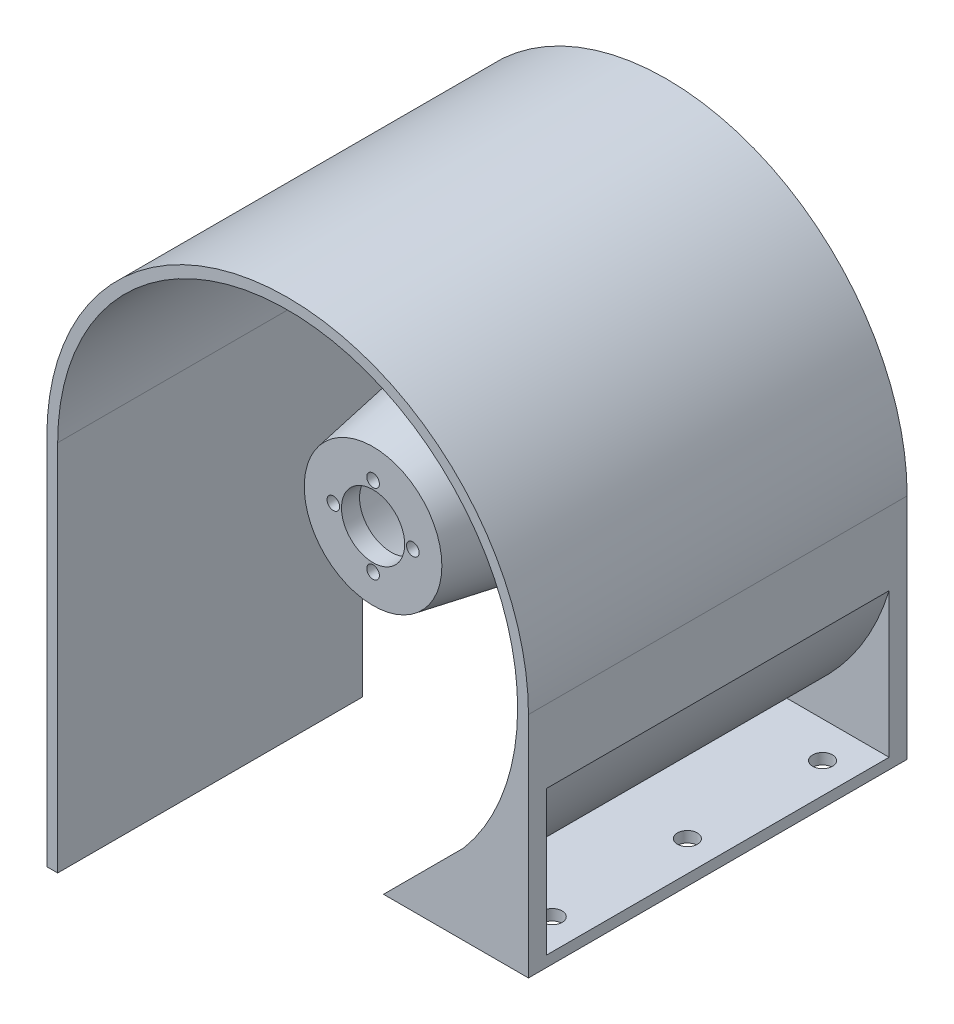
ISO-10303-21;
HEADER;
FILE_DESCRIPTION(('STEP AP214'),'2;1');
FILE_NAME('part.step','',(''),(''),'','','');
FILE_SCHEMA(('AUTOMOTIVE_DESIGN { 1 0 10303 214 1 1 1 1 }'));
ENDSEC;
DATA;
#1=APPLICATION_CONTEXT('core data for automotive mechanical design processes');
#2=APPLICATION_PROTOCOL_DEFINITION('international standard','automotive_design',2000,#1);
#3=PRODUCT_CONTEXT('',#1,'mechanical');
#4=PRODUCT('Part','Part','',(#3));
#5=PRODUCT_RELATED_PRODUCT_CATEGORY('part','',(#4));
#6=PRODUCT_DEFINITION_FORMATION('','',#4);
#7=PRODUCT_DEFINITION_CONTEXT('part definition',#1,'design');
#8=PRODUCT_DEFINITION('design','',#6,#7);
#9=PRODUCT_DEFINITION_SHAPE('','',#8);
#10=(LENGTH_UNIT() NAMED_UNIT(*) SI_UNIT(.MILLI.,.METRE.));
#11=(NAMED_UNIT(*) PLANE_ANGLE_UNIT() SI_UNIT($,.RADIAN.));
#12=(NAMED_UNIT(*) SI_UNIT($,.STERADIAN.) SOLID_ANGLE_UNIT());
#13=UNCERTAINTY_MEASURE_WITH_UNIT(LENGTH_MEASURE(1.E-05),#10,'distance_accuracy_value','');
#14=(GEOMETRIC_REPRESENTATION_CONTEXT(3) GLOBAL_UNCERTAINTY_ASSIGNED_CONTEXT((#13)) GLOBAL_UNIT_ASSIGNED_CONTEXT((#10,
#11,#12)) REPRESENTATION_CONTEXT('',''));
#15=CARTESIAN_POINT('',(0.,0.,0.));
#16=DIRECTION('',(0.,0.,1.));
#17=DIRECTION('',(1.,0.,0.));
#18=AXIS2_PLACEMENT_3D('',#15,#16,#17);
#19=CARTESIAN_POINT('',(31.75,0.,104.85));
#20=DIRECTION('',(0.,0.,1.));
#21=DIRECTION('',(1.,0.,0.));
#22=AXIS2_PLACEMENT_3D('',#19,#20,#21);
#23=PLANE('',#22);
#24=CARTESIAN_POINT('',(31.75,0.,104.85));
#25=DIRECTION('',(0.,0.,1.));
#26=DIRECTION('',(1.,0.,0.));
#27=AXIS2_PLACEMENT_3D('',#24,#25,#26);
#28=CIRCLE('',#27,63.675);
#29=CARTESIAN_POINT('',(80.527879915601,-40.9295010467903,104.85));
#30=VERTEX_POINT('',#29);
#31=CARTESIAN_POINT('',(-31.925,0.,104.85));
#32=VERTEX_POINT('',#31);
#33=EDGE_CURVE('E168',#30,#32,#28,.T.);
#34=ORIENTED_EDGE('',*,*,#33,.F.);
#35=DIRECTION('',(-0.707106781186546,-0.707106781186549,0.));
#36=VECTOR('',#35,1.);
#37=CARTESIAN_POINT('',(60.7286904811958,-60.7286904811956,104.85));
#38=LINE('',#37,#36);
#39=CARTESIAN_POINT('',(58.2823809623914,-63.175,104.85));
#40=VERTEX_POINT('',#39);
#41=EDGE_CURVE('E165',#30,#40,#38,.T.);
#42=ORIENTED_EDGE('',*,*,#41,.T.);
#43=DIRECTION('',(-1.,0.,0.));
#44=VECTOR('',#43,1.);
#45=CARTESIAN_POINT('',(98.425,-63.175,104.85));
#46=LINE('',#45,#44);
#47=CARTESIAN_POINT('',(98.425,-63.175,104.85));
#48=VERTEX_POINT('',#47);
#49=EDGE_CURVE('E242',#48,#40,#46,.T.);
#50=ORIENTED_EDGE('',*,*,#49,.F.);
#51=DIRECTION('',(0.,-1.,0.));
#52=VECTOR('',#51,1.);
#53=CARTESIAN_POINT('',(98.425,-66.675,104.85));
#54=LINE('',#53,#52);
#55=CARTESIAN_POINT('',(98.425,-4.71844785465692E-13,104.85));
#56=VERTEX_POINT('',#55);
#57=EDGE_CURVE('E249',#56,#48,#54,.T.);
#58=ORIENTED_EDGE('',*,*,#57,.F.);
#59=CARTESIAN_POINT('',(31.75,0.,104.85));
#60=DIRECTION('',(0.,0.,1.));
#61=DIRECTION('',(1.,0.,0.));
#62=AXIS2_PLACEMENT_3D('',#59,#60,#61);
#63=CIRCLE('',#62,66.675);
#64=CARTESIAN_POINT('',(-34.925,0.,104.85));
#65=VERTEX_POINT('',#64);
#66=EDGE_CURVE('E258',#56,#65,#63,.T.);
#67=ORIENTED_EDGE('',*,*,#66,.T.);
#68=DIRECTION('',(0.,-1.,0.));
#69=VECTOR('',#68,1.);
#70=CARTESIAN_POINT('',(-34.925,0.,104.85));
#71=LINE('',#70,#69);
#72=CARTESIAN_POINT('',(-34.925,-103.175,104.85));
#73=VERTEX_POINT('',#72);
#74=EDGE_CURVE('E260',#65,#73,#71,.T.);
#75=ORIENTED_EDGE('',*,*,#74,.T.);
#76=DIRECTION('',(-1.,0.,0.));
#77=VECTOR('',#76,1.);
#78=CARTESIAN_POINT('',(-34.925,-103.175,104.85));
#79=LINE('',#78,#77);
#80=CARTESIAN_POINT('',(-31.925,-103.175,104.85));
#81=VERTEX_POINT('',#80);
#82=EDGE_CURVE('E158',#81,#73,#79,.T.);
#83=ORIENTED_EDGE('',*,*,#82,.F.);
#84=DIRECTION('',(0.,-1.,0.));
#85=VECTOR('',#84,1.);
#86=CARTESIAN_POINT('',(-31.925,0.,104.85));
#87=LINE('',#86,#85);
#88=EDGE_CURVE('E185',#32,#81,#87,.T.);
#89=ORIENTED_EDGE('',*,*,#88,.F.);
#90=EDGE_LOOP('',(#34,#42,#50,#58,#67,#75,#83,#89));
#91=FACE_BOUND('',#90,.T.);
#92=ADVANCED_FACE('F46',(#91),#23,.T.);
#93=CARTESIAN_POINT('',(0.,-63.175,0.));
#94=DIRECTION('',(0.,-1.,0.));
#95=DIRECTION('',(0.,0.,-1.));
#96=AXIS2_PLACEMENT_3D('',#93,#94,#95);
#97=PLANE('',#96);
#98=DIRECTION('',(1.,0.,0.));
#99=VECTOR('',#98,1.);
#100=CARTESIAN_POINT('',(-34.925,-63.175,20.5));
#101=LINE('',#100,#99);
#102=CARTESIAN_POINT('',(-34.925,-63.175,20.5));
#103=VERTEX_POINT('',#102);
#104=CARTESIAN_POINT('',(-31.925,-63.175,20.5));
#105=VERTEX_POINT('',#104);
#106=EDGE_CURVE('E62',#103,#105,#101,.T.);
#107=ORIENTED_EDGE('',*,*,#106,.F.);
#108=DIRECTION('',(0.,0.,-1.));
#109=VECTOR('',#108,1.);
#110=CARTESIAN_POINT('',(-34.925,-63.175,104.85));
#111=LINE('',#110,#109);
#112=CARTESIAN_POINT('',(-34.925,-63.175,0.));
#113=VERTEX_POINT('',#112);
#114=EDGE_CURVE('E164',#103,#113,#111,.T.);
#115=ORIENTED_EDGE('',*,*,#114,.T.);
#116=DIRECTION('',(1.,0.,0.));
#117=VECTOR('',#116,1.);
#118=CARTESIAN_POINT('',(-34.925,-63.175,0.));
#119=LINE('',#118,#117);
#120=CARTESIAN_POINT('',(98.425,-63.175,0.));
#121=VERTEX_POINT('',#120);
#122=EDGE_CURVE('E231',#113,#121,#119,.T.);
#123=ORIENTED_EDGE('',*,*,#122,.T.);
#124=DIRECTION('',(0.,0.,1.));
#125=VECTOR('',#124,1.);
#126=CARTESIAN_POINT('',(98.425,-63.175,0.));
#127=LINE('',#126,#125);
#128=EDGE_CURVE('E240',#121,#48,#127,.T.);
#129=ORIENTED_EDGE('',*,*,#128,.T.);
#130=ORIENTED_EDGE('',*,*,#49,.T.);
#131=DIRECTION('',(0.,0.,1.));
#132=VECTOR('',#131,1.);
#133=CARTESIAN_POINT('',(58.2823809623914,-63.175,-179.746891489116));
#134=LINE('',#133,#132);
#135=CARTESIAN_POINT('',(58.2823809623914,-63.175,5.));
#136=VERTEX_POINT('',#135);
#137=EDGE_CURVE('E176',#136,#40,#134,.T.);
#138=ORIENTED_EDGE('',*,*,#137,.F.);
#139=DIRECTION('',(-1.,0.,0.));
#140=VECTOR('',#139,1.);
#141=CARTESIAN_POINT('',(0.,-63.175,5.));
#142=LINE('',#141,#140);
#143=CARTESIAN_POINT('',(-31.925,-63.175,5.));
#144=VERTEX_POINT('',#143);
#145=EDGE_CURVE('E175',#136,#144,#142,.T.);
#146=ORIENTED_EDGE('',*,*,#145,.T.);
#147=DIRECTION('',(0.,0.,1.));
#148=VECTOR('',#147,1.);
#149=CARTESIAN_POINT('',(-31.925,-63.175,-179.746891489116));
#150=LINE('',#149,#148);
#151=EDGE_CURVE('E69',#144,#105,#150,.T.);
#152=ORIENTED_EDGE('',*,*,#151,.T.);
#153=EDGE_LOOP('',(#107,#115,#123,#129,#130,#138,#146,#152));
#154=FACE_BOUND('',#153,.T.);
#155=CARTESIAN_POINT('',(90.,-63.175,89.85));
#156=DIRECTION('',(0.,-1.,0.));
#157=DIRECTION('',(0.,0.,-1.));
#158=AXIS2_PLACEMENT_3D('',#155,#156,#157);
#159=CIRCLE('',#158,2.75000000000001);
#160=CARTESIAN_POINT('',(90.,-63.175,87.1));
#161=VERTEX_POINT('',#160);
#162=EDGE_CURVE('E211',#161,#161,#159,.T.);
#163=ORIENTED_EDGE('',*,*,#162,.F.);
#164=EDGE_LOOP('',(#163));
#165=FACE_BOUND('',#164,.T.);
#166=CARTESIAN_POINT('',(90.,-63.175,14.999999906));
#167=DIRECTION('',(0.,-1.,0.));
#168=DIRECTION('',(0.,0.,-1.));
#169=AXIS2_PLACEMENT_3D('',#166,#167,#168);
#170=CIRCLE('',#169,2.75000000000001);
#171=CARTESIAN_POINT('',(90.,-63.175,12.249999906));
#172=VERTEX_POINT('',#171);
#173=EDGE_CURVE('E208',#172,#172,#170,.T.);
#174=ORIENTED_EDGE('',*,*,#173,.F.);
#175=EDGE_LOOP('',(#174));
#176=FACE_BOUND('',#175,.T.);
#177=CARTESIAN_POINT('',(90.,-63.175,52.424999953));
#178=DIRECTION('',(0.,-1.,0.));
#179=DIRECTION('',(0.,0.,-1.));
#180=AXIS2_PLACEMENT_3D('',#177,#178,#179);
#181=CIRCLE('',#180,2.75000000000001);
#182=CARTESIAN_POINT('',(90.,-63.175,49.674999953));
#183=VERTEX_POINT('',#182);
#184=EDGE_CURVE('E200',#183,#183,#181,.T.);
#185=ORIENTED_EDGE('',*,*,#184,.F.);
#186=EDGE_LOOP('',(#185));
#187=FACE_BOUND('',#186,.T.);
#188=ADVANCED_FACE('F277',(#154,#165,#176,#187),#97,.T.);
#189=CARTESIAN_POINT('',(-34.925,-63.5,104.85));
#190=DIRECTION('',(1.,0.,0.));
#191=DIRECTION('',(0.,1.,0.));
#192=AXIS2_PLACEMENT_3D('',#189,#190,#191);
#193=PLANE('',#192);
#194=ORIENTED_EDGE('',*,*,#114,.F.);
#195=DIRECTION('',(0.,1.,0.));
#196=VECTOR('',#195,1.);
#197=CARTESIAN_POINT('',(-34.925,-103.175,20.5));
#198=LINE('',#197,#196);
#199=CARTESIAN_POINT('',(-34.925,-103.175,20.5));
#200=VERTEX_POINT('',#199);
#201=EDGE_CURVE('E146',#200,#103,#198,.T.);
#202=ORIENTED_EDGE('',*,*,#201,.F.);
#203=DIRECTION('',(0.,0.,-1.));
#204=VECTOR('',#203,1.);
#205=CARTESIAN_POINT('',(-34.925,-103.175,104.85));
#206=LINE('',#205,#204);
#207=EDGE_CURVE('E152',#73,#200,#206,.T.);
#208=ORIENTED_EDGE('',*,*,#207,.F.);
#209=ORIENTED_EDGE('',*,*,#74,.F.);
#210=DIRECTION('',(0.,0.,-1.));
#211=VECTOR('',#210,1.);
#212=CARTESIAN_POINT('',(-34.925,0.,104.85));
#213=LINE('',#212,#211);
#214=CARTESIAN_POINT('',(-34.925,0.,0.));
#215=VERTEX_POINT('',#214);
#216=EDGE_CURVE('E55',#65,#215,#213,.T.);
#217=ORIENTED_EDGE('',*,*,#216,.T.);
#218=DIRECTION('',(0.,-1.,0.));
#219=VECTOR('',#218,1.);
#220=CARTESIAN_POINT('',(-34.925,-63.5,0.));
#221=LINE('',#220,#219);
#222=EDGE_CURVE('E261',#215,#113,#221,.T.);
#223=ORIENTED_EDGE('',*,*,#222,.T.);
#224=EDGE_LOOP('',(#194,#202,#208,#209,#217,#223));
#225=FACE_BOUND('',#224,.T.);
#226=ADVANCED_FACE('F162',(#225),#193,.F.);
#227=CARTESIAN_POINT('',(31.75,0.,0.));
#228=DIRECTION('',(0.,0.,1.));
#229=DIRECTION('',(1.,0.,0.));
#230=AXIS2_PLACEMENT_3D('',#227,#228,#229);
#231=PLANE('',#230);
#232=CARTESIAN_POINT('',(31.75,0.,0.));
#233=DIRECTION('',(0.,0.,1.));
#234=DIRECTION('',(1.,0.,0.));
#235=AXIS2_PLACEMENT_3D('',#232,#233,#234);
#236=CIRCLE('',#235,28.2906177740984);
#237=CARTESIAN_POINT('',(60.0406177740984,0.,0.));
#238=VERTEX_POINT('',#237);
#239=EDGE_CURVE('E303',#238,#238,#236,.F.);
#240=ORIENTED_EDGE('',*,*,#239,.F.);
#241=EDGE_LOOP('',(#240));
#242=FACE_BOUND('',#241,.T.);
#243=ORIENTED_EDGE('',*,*,#122,.F.);
#244=ORIENTED_EDGE('',*,*,#222,.F.);
#245=CARTESIAN_POINT('',(31.75,0.,0.));
#246=DIRECTION('',(0.,0.,1.));
#247=DIRECTION('',(1.,0.,0.));
#248=AXIS2_PLACEMENT_3D('',#245,#246,#247);
#249=CIRCLE('',#248,66.675);
#250=CARTESIAN_POINT('',(98.425,-4.65589036534732E-13,0.));
#251=VERTEX_POINT('',#250);
#252=EDGE_CURVE('E257',#251,#215,#249,.T.);
#253=ORIENTED_EDGE('',*,*,#252,.F.);
#254=DIRECTION('',(0.,-1.,0.));
#255=VECTOR('',#254,1.);
#256=CARTESIAN_POINT('',(98.425,-66.675,0.));
#257=LINE('',#256,#255);
#258=EDGE_CURVE('E246',#251,#121,#257,.T.);
#259=ORIENTED_EDGE('',*,*,#258,.T.);
#260=EDGE_LOOP('',(#243,#244,#253,#259));
#261=FACE_BOUND('',#260,.T.);
#262=ADVANCED_FACE('F275',(#242,#261),#231,.F.);
#263=CARTESIAN_POINT('',(98.425,-66.675,199.142689271226));
#264=DIRECTION('',(1.,0.,0.));
#265=DIRECTION('',(0.,0.,-1.));
#266=AXIS2_PLACEMENT_3D('',#263,#264,#265);
#267=PLANE('',#266);
#268=DIRECTION('',(0.,1.,0.));
#269=VECTOR('',#268,1.);
#270=CARTESIAN_POINT('',(98.425,0.,4.999999906));
#271=LINE('',#270,#269);
#272=CARTESIAN_POINT('',(98.425,-60.175,4.999999906));
#273=VERTEX_POINT('',#272);
#274=CARTESIAN_POINT('',(98.425,-20.2249845488198,4.999999906));
#275=VERTEX_POINT('',#274);
#276=EDGE_CURVE('E219',#273,#275,#271,.T.);
#277=ORIENTED_EDGE('',*,*,#276,.F.);
#278=DIRECTION('',(0.,0.,-1.));
#279=VECTOR('',#278,1.);
#280=CARTESIAN_POINT('',(98.425,-60.175,155.757538457847));
#281=LINE('',#280,#279);
#282=CARTESIAN_POINT('',(98.425,-60.175,99.85));
#283=VERTEX_POINT('',#282);
#284=EDGE_CURVE('E221',#283,#273,#281,.T.);
#285=ORIENTED_EDGE('',*,*,#284,.F.);
#286=DIRECTION('',(0.,1.,0.));
#287=VECTOR('',#286,1.);
#288=CARTESIAN_POINT('',(98.425,0.,99.85));
#289=LINE('',#288,#287);
#290=CARTESIAN_POINT('',(98.425,-20.2249845488198,99.85));
#291=VERTEX_POINT('',#290);
#292=EDGE_CURVE('E218',#283,#291,#289,.T.);
#293=ORIENTED_EDGE('',*,*,#292,.T.);
#294=DIRECTION('',(0.,0.,-1.));
#295=VECTOR('',#294,1.);
#296=CARTESIAN_POINT('',(98.425,-20.2249845488198,155.757538457847));
#297=LINE('',#296,#295);
#298=EDGE_CURVE('E214',#291,#275,#297,.T.);
#299=ORIENTED_EDGE('',*,*,#298,.T.);
#300=EDGE_LOOP('',(#277,#285,#293,#299));
#301=FACE_BOUND('',#300,.T.);
#302=ORIENTED_EDGE('',*,*,#57,.T.);
#303=ORIENTED_EDGE('',*,*,#128,.F.);
#304=ORIENTED_EDGE('',*,*,#258,.F.);
#305=DIRECTION('',(0.,0.,-1.));
#306=VECTOR('',#305,1.);
#307=CARTESIAN_POINT('',(98.425,-4.65589036534732E-13,199.142689271226));
#308=LINE('',#307,#306);
#309=EDGE_CURVE('E253',#56,#251,#308,.T.);
#310=ORIENTED_EDGE('',*,*,#309,.F.);
#311=EDGE_LOOP('',(#302,#303,#304,#310));
#312=FACE_BOUND('',#311,.T.);
#313=ADVANCED_FACE('F281',(#301,#312),#267,.T.);
#314=CARTESIAN_POINT('',(31.75,0.,104.85));
#315=DIRECTION('',(0.,0.,-1.));
#316=DIRECTION('',(-1.,0.,0.));
#317=AXIS2_PLACEMENT_3D('',#314,#315,#316);
#318=CYLINDRICAL_SURFACE('',#317,66.675);
#319=ORIENTED_EDGE('',*,*,#66,.F.);
#320=ORIENTED_EDGE('',*,*,#309,.T.);
#321=ORIENTED_EDGE('',*,*,#252,.T.);
#322=ORIENTED_EDGE('',*,*,#216,.F.);
#323=EDGE_LOOP('',(#319,#320,#321,#322));
#324=FACE_BOUND('',#323,.T.);
#325=ADVANCED_FACE('F270',(#324),#318,.T.);
#326=CARTESIAN_POINT('',(31.75,0.,155.757538457847));
#327=DIRECTION('',(0.,0.,-1.));
#328=DIRECTION('',(-1.,0.,0.));
#329=AXIS2_PLACEMENT_3D('',#326,#327,#328);
#330=CYLINDRICAL_SURFACE('',#329,69.675);
#331=CARTESIAN_POINT('',(31.75,0.,99.85));
#332=DIRECTION('',(0.,0.,1.));
#333=DIRECTION('',(1.,0.,0.));
#334=AXIS2_PLACEMENT_3D('',#331,#332,#333);
#335=CIRCLE('',#334,69.675);
#336=CARTESIAN_POINT('',(66.8722863720459,-60.175,99.85));
#337=VERTEX_POINT('',#336);
#338=EDGE_CURVE('E228',#291,#337,#335,.F.);
#339=ORIENTED_EDGE('',*,*,#338,.T.);
#340=DIRECTION('',(0.,0.,-1.));
#341=VECTOR('',#340,1.);
#342=CARTESIAN_POINT('',(66.8722863720459,-60.175,155.757538457847));
#343=LINE('',#342,#341);
#344=CARTESIAN_POINT('',(66.8722863720459,-60.175,4.999999906));
#345=VERTEX_POINT('',#344);
#346=EDGE_CURVE('E227',#337,#345,#343,.T.);
#347=ORIENTED_EDGE('',*,*,#346,.T.);
#348=CARTESIAN_POINT('',(31.75,0.,4.999999906));
#349=DIRECTION('',(0.,0.,-1.));
#350=DIRECTION('',(-1.,0.,0.));
#351=AXIS2_PLACEMENT_3D('',#348,#349,#350);
#352=CIRCLE('',#351,69.675);
#353=EDGE_CURVE('E222',#275,#345,#352,.T.);
#354=ORIENTED_EDGE('',*,*,#353,.F.);
#355=ORIENTED_EDGE('',*,*,#298,.F.);
#356=EDGE_LOOP('',(#339,#347,#354,#355));
#357=FACE_BOUND('',#356,.T.);
#358=ADVANCED_FACE('F403',(#357),#330,.T.);
#359=CARTESIAN_POINT('',(0.,-60.175,155.757538457847));
#360=DIRECTION('',(0.,-1.,0.));
#361=DIRECTION('',(0.,0.,-1.));
#362=AXIS2_PLACEMENT_3D('',#359,#360,#361);
#363=PLANE('',#362);
#364=CARTESIAN_POINT('',(90.,-60.175,89.85));
#365=DIRECTION('',(0.,1.,0.));
#366=DIRECTION('',(0.,0.,1.));
#367=AXIS2_PLACEMENT_3D('',#364,#365,#366);
#368=CIRCLE('',#367,2.75000000000001);
#369=CARTESIAN_POINT('',(90.,-60.175,92.6));
#370=VERTEX_POINT('',#369);
#371=EDGE_CURVE('E197',#370,#370,#368,.T.);
#372=ORIENTED_EDGE('',*,*,#371,.F.);
#373=EDGE_LOOP('',(#372));
#374=FACE_BOUND('',#373,.T.);
#375=CARTESIAN_POINT('',(90.,-60.175,14.999999906));
#376=DIRECTION('',(0.,1.,0.));
#377=DIRECTION('',(0.,0.,1.));
#378=AXIS2_PLACEMENT_3D('',#375,#376,#377);
#379=CIRCLE('',#378,2.75000000000001);
#380=CARTESIAN_POINT('',(90.,-60.175,17.749999906));
#381=VERTEX_POINT('',#380);
#382=EDGE_CURVE('E201',#381,#381,#379,.T.);
#383=ORIENTED_EDGE('',*,*,#382,.F.);
#384=EDGE_LOOP('',(#383));
#385=FACE_BOUND('',#384,.T.);
#386=CARTESIAN_POINT('',(90.,-60.175,52.424999953));
#387=DIRECTION('',(0.,1.,0.));
#388=DIRECTION('',(0.,0.,1.));
#389=AXIS2_PLACEMENT_3D('',#386,#387,#388);
#390=CIRCLE('',#389,2.75000000000001);
#391=CARTESIAN_POINT('',(90.,-60.175,55.174999953));
#392=VERTEX_POINT('',#391);
#393=EDGE_CURVE('E196',#392,#392,#390,.T.);
#394=ORIENTED_EDGE('',*,*,#393,.F.);
#395=EDGE_LOOP('',(#394));
#396=FACE_BOUND('',#395,.T.);
#397=ORIENTED_EDGE('',*,*,#284,.T.);
#398=DIRECTION('',(-1.,0.,0.));
#399=VECTOR('',#398,1.);
#400=CARTESIAN_POINT('',(0.,-60.175,4.999999906));
#401=LINE('',#400,#399);
#402=EDGE_CURVE('E215',#273,#345,#401,.T.);
#403=ORIENTED_EDGE('',*,*,#402,.T.);
#404=ORIENTED_EDGE('',*,*,#346,.F.);
#405=DIRECTION('',(-1.,0.,0.));
#406=VECTOR('',#405,1.);
#407=CARTESIAN_POINT('',(0.,-60.175,99.85));
#408=LINE('',#407,#406);
#409=EDGE_CURVE('E225',#283,#337,#408,.T.);
#410=ORIENTED_EDGE('',*,*,#409,.F.);
#411=EDGE_LOOP('',(#397,#403,#404,#410));
#412=FACE_BOUND('',#411,.T.);
#413=ADVANCED_FACE('F407',(#374,#385,#396,#412),#363,.F.);
#414=CARTESIAN_POINT('',(0.,0.,4.999999906));
#415=DIRECTION('',(0.,0.,-1.));
#416=DIRECTION('',(-1.,0.,0.));
#417=AXIS2_PLACEMENT_3D('',#414,#415,#416);
#418=PLANE('',#417);
#419=ORIENTED_EDGE('',*,*,#353,.T.);
#420=ORIENTED_EDGE('',*,*,#402,.F.);
#421=ORIENTED_EDGE('',*,*,#276,.T.);
#422=EDGE_LOOP('',(#419,#420,#421));
#423=FACE_BOUND('',#422,.T.);
#424=ADVANCED_FACE('F419',(#423),#418,.F.);
#425=CARTESIAN_POINT('',(31.75,0.,99.85));
#426=DIRECTION('',(0.,0.,1.));
#427=DIRECTION('',(1.,0.,0.));
#428=AXIS2_PLACEMENT_3D('',#425,#426,#427);
#429=PLANE('',#428);
#430=ORIENTED_EDGE('',*,*,#292,.F.);
#431=ORIENTED_EDGE('',*,*,#409,.T.);
#432=ORIENTED_EDGE('',*,*,#338,.F.);
#433=EDGE_LOOP('',(#430,#431,#432));
#434=FACE_BOUND('',#433,.T.);
#435=ADVANCED_FACE('F424',(#434),#429,.F.);
#436=CARTESIAN_POINT('',(90.,-65.175,52.424999953));
#437=DIRECTION('',(0.,1.,0.));
#438=DIRECTION('',(0.,0.,1.));
#439=AXIS2_PLACEMENT_3D('',#436,#437,#438);
#440=CYLINDRICAL_SURFACE('',#439,2.75000000000001);
#441=ORIENTED_EDGE('',*,*,#184,.T.);
#442=EDGE_LOOP('',(#441));
#443=FACE_BOUND('',#442,.T.);
#444=ORIENTED_EDGE('',*,*,#393,.T.);
#445=EDGE_LOOP('',(#444));
#446=FACE_BOUND('',#445,.T.);
#447=ADVANCED_FACE('F426',(#443,#446),#440,.F.);
#448=CARTESIAN_POINT('',(90.,-65.175,14.999999906));
#449=DIRECTION('',(0.,1.,0.));
#450=DIRECTION('',(0.,0.,1.));
#451=AXIS2_PLACEMENT_3D('',#448,#449,#450);
#452=CYLINDRICAL_SURFACE('',#451,2.75000000000001);
#453=ORIENTED_EDGE('',*,*,#173,.T.);
#454=EDGE_LOOP('',(#453));
#455=FACE_BOUND('',#454,.T.);
#456=ORIENTED_EDGE('',*,*,#382,.T.);
#457=EDGE_LOOP('',(#456));
#458=FACE_BOUND('',#457,.T.);
#459=ADVANCED_FACE('F433',(#455,#458),#452,.F.);
#460=CARTESIAN_POINT('',(90.,-65.175,89.85));
#461=DIRECTION('',(0.,1.,0.));
#462=DIRECTION('',(0.,0.,1.));
#463=AXIS2_PLACEMENT_3D('',#460,#461,#462);
#464=CYLINDRICAL_SURFACE('',#463,2.75000000000001);
#465=ORIENTED_EDGE('',*,*,#162,.T.);
#466=EDGE_LOOP('',(#465));
#467=FACE_BOUND('',#466,.T.);
#468=ORIENTED_EDGE('',*,*,#371,.T.);
#469=EDGE_LOOP('',(#468));
#470=FACE_BOUND('',#469,.T.);
#471=ADVANCED_FACE('F443',(#467,#470),#464,.F.);
#472=CARTESIAN_POINT('',(60.7286904811958,-60.7286904811956,-179.746891489116));
#473=DIRECTION('',(-0.707106781186549,0.707106781186546,0.));
#474=DIRECTION('',(-0.707106781186546,-0.707106781186549,0.));
#475=AXIS2_PLACEMENT_3D('',#472,#473,#474);
#476=PLANE('',#475);
#477=ORIENTED_EDGE('',*,*,#137,.T.);
#478=ORIENTED_EDGE('',*,*,#41,.F.);
#479=DIRECTION('',(0.,0.,1.));
#480=VECTOR('',#479,1.);
#481=CARTESIAN_POINT('',(80.527879915601,-40.9295010467903,-179.746891489116));
#482=LINE('',#481,#480);
#483=CARTESIAN_POINT('',(80.527879915601,-40.9295010467903,5.));
#484=VERTEX_POINT('',#483);
#485=EDGE_CURVE('E187',#484,#30,#482,.T.);
#486=ORIENTED_EDGE('',*,*,#485,.F.);
#487=DIRECTION('',(0.707106781186546,0.707106781186549,0.));
#488=VECTOR('',#487,1.);
#489=CARTESIAN_POINT('',(60.7286904811958,-60.7286904811956,5.));
#490=LINE('',#489,#488);
#491=EDGE_CURVE('E179',#136,#484,#490,.T.);
#492=ORIENTED_EDGE('',*,*,#491,.F.);
#493=EDGE_LOOP('',(#477,#478,#486,#492));
#494=FACE_BOUND('',#493,.T.);
#495=ADVANCED_FACE('F288',(#494),#476,.T.);
#496=CARTESIAN_POINT('',(-31.925,0.,-179.746891489116));
#497=DIRECTION('',(-1.,0.,0.));
#498=DIRECTION('',(0.,0.,1.));
#499=AXIS2_PLACEMENT_3D('',#496,#497,#498);
#500=PLANE('',#499);
#501=DIRECTION('',(0.,1.,0.));
#502=VECTOR('',#501,1.);
#503=CARTESIAN_POINT('',(-31.925,0.,5.));
#504=LINE('',#503,#502);
#505=CARTESIAN_POINT('',(-31.925,0.,5.));
#506=VERTEX_POINT('',#505);
#507=EDGE_CURVE('E173',#144,#506,#504,.T.);
#508=ORIENTED_EDGE('',*,*,#507,.T.);
#509=DIRECTION('',(0.,0.,1.));
#510=VECTOR('',#509,1.);
#511=CARTESIAN_POINT('',(-31.925,0.,-179.746891489116));
#512=LINE('',#511,#510);
#513=EDGE_CURVE('E190',#506,#32,#512,.T.);
#514=ORIENTED_EDGE('',*,*,#513,.T.);
#515=ORIENTED_EDGE('',*,*,#88,.T.);
#516=DIRECTION('',(0.,0.,1.));
#517=VECTOR('',#516,1.);
#518=CARTESIAN_POINT('',(-31.925,-103.175,104.85));
#519=LINE('',#518,#517);
#520=CARTESIAN_POINT('',(-31.925,-103.175,20.5));
#521=VERTEX_POINT('',#520);
#522=EDGE_CURVE('E151',#521,#81,#519,.T.);
#523=ORIENTED_EDGE('',*,*,#522,.F.);
#524=DIRECTION('',(0.,1.,0.));
#525=VECTOR('',#524,1.);
#526=CARTESIAN_POINT('',(-31.925,-103.175,20.5));
#527=LINE('',#526,#525);
#528=EDGE_CURVE('E147',#521,#105,#527,.T.);
#529=ORIENTED_EDGE('',*,*,#528,.T.);
#530=ORIENTED_EDGE('',*,*,#151,.F.);
#531=EDGE_LOOP('',(#508,#514,#515,#523,#529,#530));
#532=FACE_BOUND('',#531,.T.);
#533=ADVANCED_FACE('F294',(#532),#500,.F.);
#534=CARTESIAN_POINT('',(31.75,0.,-179.746891489116));
#535=DIRECTION('',(0.,0.,1.));
#536=DIRECTION('',(1.,0.,0.));
#537=AXIS2_PLACEMENT_3D('',#534,#535,#536);
#538=CYLINDRICAL_SURFACE('',#537,63.675);
#539=CARTESIAN_POINT('',(31.75,0.,5.));
#540=DIRECTION('',(0.,0.,1.));
#541=DIRECTION('',(1.,0.,0.));
#542=AXIS2_PLACEMENT_3D('',#539,#540,#541);
#543=CIRCLE('',#542,63.675);
#544=EDGE_CURVE('E181',#506,#484,#543,.F.);
#545=ORIENTED_EDGE('',*,*,#544,.T.);
#546=ORIENTED_EDGE('',*,*,#485,.T.);
#547=ORIENTED_EDGE('',*,*,#33,.T.);
#548=ORIENTED_EDGE('',*,*,#513,.F.);
#549=EDGE_LOOP('',(#545,#546,#547,#548));
#550=FACE_BOUND('',#549,.T.);
#551=ADVANCED_FACE('F296',(#550),#538,.F.);
#552=CARTESIAN_POINT('',(31.75,0.,5.));
#553=DIRECTION('',(0.,0.,1.));
#554=DIRECTION('',(1.,0.,0.));
#555=AXIS2_PLACEMENT_3D('',#552,#553,#554);
#556=PLANE('',#555);
#557=CARTESIAN_POINT('',(31.75,0.,5.));
#558=DIRECTION('',(0.,0.,1.));
#559=DIRECTION('',(1.,0.,0.));
#560=AXIS2_PLACEMENT_3D('',#557,#558,#559);
#561=CIRCLE('',#560,32.4861159299848);
#562=CARTESIAN_POINT('',(64.2361159299848,0.,5.));
#563=VERTEX_POINT('',#562);
#564=EDGE_CURVE('E13',#563,#563,#561,.F.);
#565=ORIENTED_EDGE('',*,*,#564,.T.);
#566=EDGE_LOOP('',(#565));
#567=FACE_BOUND('',#566,.T.);
#568=ORIENTED_EDGE('',*,*,#145,.F.);
#569=ORIENTED_EDGE('',*,*,#491,.T.);
#570=ORIENTED_EDGE('',*,*,#544,.F.);
#571=ORIENTED_EDGE('',*,*,#507,.F.);
#572=EDGE_LOOP('',(#568,#569,#570,#571));
#573=FACE_BOUND('',#572,.T.);
#574=ADVANCED_FACE('F292',(#567,#573),#556,.T.);
#575=CARTESIAN_POINT('',(-34.925,-103.175,20.5));
#576=DIRECTION('',(0.,0.,1.));
#577=DIRECTION('',(1.,0.,0.));
#578=AXIS2_PLACEMENT_3D('',#575,#576,#577);
#579=PLANE('',#578);
#580=ORIENTED_EDGE('',*,*,#106,.T.);
#581=ORIENTED_EDGE('',*,*,#528,.F.);
#582=DIRECTION('',(1.,0.,0.));
#583=VECTOR('',#582,1.);
#584=CARTESIAN_POINT('',(-34.925,-103.175,20.5));
#585=LINE('',#584,#583);
#586=EDGE_CURVE('E142',#200,#521,#585,.T.);
#587=ORIENTED_EDGE('',*,*,#586,.F.);
#588=ORIENTED_EDGE('',*,*,#201,.T.);
#589=EDGE_LOOP('',(#580,#581,#587,#588));
#590=FACE_BOUND('',#589,.T.);
#591=ADVANCED_FACE('F144',(#590),#579,.F.);
#592=CARTESIAN_POINT('',(0.,-103.175,0.));
#593=DIRECTION('',(0.,-1.,0.));
#594=DIRECTION('',(0.,0.,-1.));
#595=AXIS2_PLACEMENT_3D('',#592,#593,#594);
#596=PLANE('',#595);
#597=ORIENTED_EDGE('',*,*,#207,.T.);
#598=ORIENTED_EDGE('',*,*,#586,.T.);
#599=ORIENTED_EDGE('',*,*,#522,.T.);
#600=ORIENTED_EDGE('',*,*,#82,.T.);
#601=EDGE_LOOP('',(#597,#598,#599,#600));
#602=FACE_BOUND('',#601,.T.);
#603=ADVANCED_FACE('F156',(#602),#596,.T.);
#604=CARTESIAN_POINT('',(31.75,0.,81.2));
#605=DIRECTION('',(0.,0.,1.));
#606=DIRECTION('',(1.,0.,0.));
#607=AXIS2_PLACEMENT_3D('',#604,#605,#606);
#608=PLANE('',#607);
#609=CARTESIAN_POINT('',(31.75,11.,81.2));
#610=DIRECTION('',(0.,0.,1.));
#611=DIRECTION('',(1.,0.,0.));
#612=AXIS2_PLACEMENT_3D('',#609,#610,#611);
#613=CIRCLE('',#612,1.75);
#614=CARTESIAN_POINT('',(33.5,11.,81.2));
#615=VERTEX_POINT('',#614);
#616=EDGE_CURVE('E343',#615,#615,#613,.T.);
#617=ORIENTED_EDGE('',*,*,#616,.F.);
#618=EDGE_LOOP('',(#617));
#619=FACE_BOUND('',#618,.T.);
#620=CARTESIAN_POINT('',(42.7500000000001,1.11022302462516E-13,81.2));
#621=DIRECTION('',(0.,0.,1.));
#622=DIRECTION('',(1.,0.,0.));
#623=AXIS2_PLACEMENT_3D('',#620,#621,#622);
#624=CIRCLE('',#623,1.75);
#625=CARTESIAN_POINT('',(44.5000000000001,1.11022302462516E-13,81.2));
#626=VERTEX_POINT('',#625);
#627=EDGE_CURVE('E336',#626,#626,#624,.T.);
#628=ORIENTED_EDGE('',*,*,#627,.F.);
#629=EDGE_LOOP('',(#628));
#630=FACE_BOUND('',#629,.T.);
#631=CARTESIAN_POINT('',(31.7500000000002,-11.,81.2));
#632=DIRECTION('',(0.,0.,1.));
#633=DIRECTION('',(1.,0.,0.));
#634=AXIS2_PLACEMENT_3D('',#631,#632,#633);
#635=CIRCLE('',#634,1.75000000000001);
#636=CARTESIAN_POINT('',(33.5000000000002,-11.,81.2));
#637=VERTEX_POINT('',#636);
#638=EDGE_CURVE('E328',#637,#637,#635,.T.);
#639=ORIENTED_EDGE('',*,*,#638,.F.);
#640=EDGE_LOOP('',(#639));
#641=FACE_BOUND('',#640,.T.);
#642=CARTESIAN_POINT('',(20.7500000000002,0.,81.2));
#643=DIRECTION('',(0.,0.,1.));
#644=DIRECTION('',(1.,0.,0.));
#645=AXIS2_PLACEMENT_3D('',#642,#643,#644);
#646=CIRCLE('',#645,1.75);
#647=CARTESIAN_POINT('',(22.5000000000002,0.,81.2));
#648=VERTEX_POINT('',#647);
#649=EDGE_CURVE('E329',#648,#648,#646,.T.);
#650=ORIENTED_EDGE('',*,*,#649,.F.);
#651=EDGE_LOOP('',(#650));
#652=FACE_BOUND('',#651,.T.);
#653=CARTESIAN_POINT('',(31.75,0.,81.2));
#654=DIRECTION('',(0.,0.,1.));
#655=DIRECTION('',(1.,0.,0.));
#656=AXIS2_PLACEMENT_3D('',#653,#654,#655);
#657=CIRCLE('',#656,8.75);
#658=CARTESIAN_POINT('',(40.5,0.,81.2));
#659=VERTEX_POINT('',#658);
#660=EDGE_CURVE('E320',#659,#659,#657,.T.);
#661=ORIENTED_EDGE('',*,*,#660,.F.);
#662=EDGE_LOOP('',(#661));
#663=FACE_BOUND('',#662,.T.);
#664=CARTESIAN_POINT('',(31.75,0.,81.2));
#665=DIRECTION('',(0.,0.,1.));
#666=DIRECTION('',(1.,0.,0.));
#667=AXIS2_PLACEMENT_3D('',#664,#665,#666);
#668=CIRCLE('',#667,19.05);
#669=CARTESIAN_POINT('',(50.8,0.,81.2));
#670=VERTEX_POINT('',#669);
#671=EDGE_CURVE('E300',#670,#670,#668,.T.);
#672=ORIENTED_EDGE('',*,*,#671,.T.);
#673=EDGE_LOOP('',(#672));
#674=FACE_BOUND('',#673,.T.);
#675=ADVANCED_FACE('F356',(#619,#630,#641,#652,#663,#674),#608,.T.);
#676=CARTESIAN_POINT('',(31.75,0.,81.1999999999977));
#677=DIRECTION('',(0.,0.,-1.));
#678=DIRECTION('',(-1.,0.,0.));
#679=AXIS2_PLACEMENT_3D('',#676,#677,#678);
#680=CONICAL_SURFACE('',#679,19.05,0.174532925199435);
#681=ORIENTED_EDGE('',*,*,#564,.F.);
#682=EDGE_LOOP('',(#681));
#683=FACE_BOUND('',#682,.T.);
#684=ORIENTED_EDGE('',*,*,#671,.F.);
#685=EDGE_LOOP('',(#684));
#686=FACE_BOUND('',#685,.T.);
#687=ADVANCED_FACE('F48',(#683,#686),#680,.T.);
#688=CARTESIAN_POINT('',(31.75,0.,76.2));
#689=DIRECTION('',(0.,0.,1.));
#690=DIRECTION('',(1.,0.,0.));
#691=AXIS2_PLACEMENT_3D('',#688,#689,#690);
#692=PLANE('',#691);
#693=CARTESIAN_POINT('',(31.75,11.,76.2));
#694=DIRECTION('',(0.,0.,1.));
#695=DIRECTION('',(1.,0.,0.));
#696=AXIS2_PLACEMENT_3D('',#693,#694,#695);
#697=CIRCLE('',#696,1.75);
#698=CARTESIAN_POINT('',(33.5,11.,76.2));
#699=VERTEX_POINT('',#698);
#700=EDGE_CURVE('E324',#699,#699,#697,.F.);
#701=ORIENTED_EDGE('',*,*,#700,.F.);
#702=EDGE_LOOP('',(#701));
#703=FACE_BOUND('',#702,.T.);
#704=CARTESIAN_POINT('',(42.7500000000001,1.11022302462516E-13,76.2));
#705=DIRECTION('',(0.,0.,1.));
#706=DIRECTION('',(1.,0.,0.));
#707=AXIS2_PLACEMENT_3D('',#704,#705,#706);
#708=CIRCLE('',#707,1.75);
#709=CARTESIAN_POINT('',(44.5000000000001,1.11022302462516E-13,76.2));
#710=VERTEX_POINT('',#709);
#711=EDGE_CURVE('E339',#710,#710,#708,.F.);
#712=ORIENTED_EDGE('',*,*,#711,.F.);
#713=EDGE_LOOP('',(#712));
#714=FACE_BOUND('',#713,.T.);
#715=CARTESIAN_POINT('',(31.7500000000002,-11.,76.2));
#716=DIRECTION('',(0.,0.,1.));
#717=DIRECTION('',(1.,0.,0.));
#718=AXIS2_PLACEMENT_3D('',#715,#716,#717);
#719=CIRCLE('',#718,1.75000000000001);
#720=CARTESIAN_POINT('',(33.5000000000002,-11.,76.2));
#721=VERTEX_POINT('',#720);
#722=EDGE_CURVE('E332',#721,#721,#719,.F.);
#723=ORIENTED_EDGE('',*,*,#722,.F.);
#724=EDGE_LOOP('',(#723));
#725=FACE_BOUND('',#724,.T.);
#726=CARTESIAN_POINT('',(20.7500000000002,0.,76.2));
#727=DIRECTION('',(0.,0.,1.));
#728=DIRECTION('',(1.,0.,0.));
#729=AXIS2_PLACEMENT_3D('',#726,#727,#728);
#730=CIRCLE('',#729,1.75);
#731=CARTESIAN_POINT('',(22.5000000000002,0.,76.2));
#732=VERTEX_POINT('',#731);
#733=EDGE_CURVE('E325',#732,#732,#730,.F.);
#734=ORIENTED_EDGE('',*,*,#733,.F.);
#735=EDGE_LOOP('',(#734));
#736=FACE_BOUND('',#735,.T.);
#737=CARTESIAN_POINT('',(31.75,0.,76.2));
#738=DIRECTION('',(0.,0.,1.));
#739=DIRECTION('',(1.,0.,0.));
#740=AXIS2_PLACEMENT_3D('',#737,#738,#739);
#741=CIRCLE('',#740,8.75);
#742=CARTESIAN_POINT('',(40.5,0.,76.2));
#743=VERTEX_POINT('',#742);
#744=EDGE_CURVE('E315',#743,#743,#741,.F.);
#745=ORIENTED_EDGE('',*,*,#744,.F.);
#746=EDGE_LOOP('',(#745));
#747=FACE_BOUND('',#746,.T.);
#748=CARTESIAN_POINT('',(31.75,0.,76.2));
#749=DIRECTION('',(0.,0.,1.));
#750=DIRECTION('',(1.,0.,0.));
#751=AXIS2_PLACEMENT_3D('',#748,#749,#750);
#752=CIRCLE('',#751,14.8545018441132);
#753=CARTESIAN_POINT('',(46.6045018441132,0.,76.2));
#754=VERTEX_POINT('',#753);
#755=EDGE_CURVE('E310',#754,#754,#752,.T.);
#756=ORIENTED_EDGE('',*,*,#755,.F.);
#757=EDGE_LOOP('',(#756));
#758=FACE_BOUND('',#757,.T.);
#759=ADVANCED_FACE('F376',(#703,#714,#725,#736,#747,#758),#692,.F.);
#760=CARTESIAN_POINT('',(31.75,0.,80.331759111663));
#761=DIRECTION('',(0.,0.,-1.));
#762=DIRECTION('',(-1.,0.,0.));
#763=AXIS2_PLACEMENT_3D('',#760,#761,#762);
#764=CONICAL_SURFACE('',#763,14.125961234939,0.174532925199435);
#765=ORIENTED_EDGE('',*,*,#239,.T.);
#766=EDGE_LOOP('',(#765));
#767=FACE_BOUND('',#766,.T.);
#768=ORIENTED_EDGE('',*,*,#755,.T.);
#769=EDGE_LOOP('',(#768));
#770=FACE_BOUND('',#769,.T.);
#771=ADVANCED_FACE('F372',(#767,#770),#764,.F.);
#772=CARTESIAN_POINT('',(31.75,0.,-0.001000000000001));
#773=DIRECTION('',(0.,0.,1.));
#774=DIRECTION('',(1.,0.,0.));
#775=AXIS2_PLACEMENT_3D('',#772,#773,#774);
#776=CYLINDRICAL_SURFACE('',#775,8.75);
#777=ORIENTED_EDGE('',*,*,#660,.T.);
#778=EDGE_LOOP('',(#777));
#779=FACE_BOUND('',#778,.T.);
#780=ORIENTED_EDGE('',*,*,#744,.T.);
#781=EDGE_LOOP('',(#780));
#782=FACE_BOUND('',#781,.T.);
#783=ADVANCED_FACE('F368',(#779,#782),#776,.F.);
#784=CARTESIAN_POINT('',(20.7500000000002,0.,-0.001000000000001));
#785=DIRECTION('',(0.,0.,1.));
#786=DIRECTION('',(1.,0.,0.));
#787=AXIS2_PLACEMENT_3D('',#784,#785,#786);
#788=CYLINDRICAL_SURFACE('',#787,1.75);
#789=ORIENTED_EDGE('',*,*,#649,.T.);
#790=EDGE_LOOP('',(#789));
#791=FACE_BOUND('',#790,.T.);
#792=ORIENTED_EDGE('',*,*,#733,.T.);
#793=EDGE_LOOP('',(#792));
#794=FACE_BOUND('',#793,.T.);
#795=ADVANCED_FACE('F371',(#791,#794),#788,.F.);
#796=CARTESIAN_POINT('',(31.7500000000002,-11.,-0.001000000000001));
#797=DIRECTION('',(0.,0.,1.));
#798=DIRECTION('',(1.,0.,0.));
#799=AXIS2_PLACEMENT_3D('',#796,#797,#798);
#800=CYLINDRICAL_SURFACE('',#799,1.75000000000001);
#801=ORIENTED_EDGE('',*,*,#638,.T.);
#802=EDGE_LOOP('',(#801));
#803=FACE_BOUND('',#802,.T.);
#804=ORIENTED_EDGE('',*,*,#722,.T.);
#805=EDGE_LOOP('',(#804));
#806=FACE_BOUND('',#805,.T.);
#807=ADVANCED_FACE('F493',(#803,#806),#800,.F.);
#808=CARTESIAN_POINT('',(42.7500000000001,1.11022302462516E-13,-0.001000000000001));
#809=DIRECTION('',(0.,0.,1.));
#810=DIRECTION('',(1.,0.,0.));
#811=AXIS2_PLACEMENT_3D('',#808,#809,#810);
#812=CYLINDRICAL_SURFACE('',#811,1.75);
#813=ORIENTED_EDGE('',*,*,#627,.T.);
#814=EDGE_LOOP('',(#813));
#815=FACE_BOUND('',#814,.T.);
#816=ORIENTED_EDGE('',*,*,#711,.T.);
#817=EDGE_LOOP('',(#816));
#818=FACE_BOUND('',#817,.T.);
#819=ADVANCED_FACE('F484',(#815,#818),#812,.F.);
#820=CARTESIAN_POINT('',(31.75,11.,-0.001000000000001));
#821=DIRECTION('',(0.,0.,1.));
#822=DIRECTION('',(1.,0.,0.));
#823=AXIS2_PLACEMENT_3D('',#820,#821,#822);
#824=CYLINDRICAL_SURFACE('',#823,1.75);
#825=ORIENTED_EDGE('',*,*,#616,.T.);
#826=EDGE_LOOP('',(#825));
#827=FACE_BOUND('',#826,.T.);
#828=ORIENTED_EDGE('',*,*,#700,.T.);
#829=EDGE_LOOP('',(#828));
#830=FACE_BOUND('',#829,.T.);
#831=ADVANCED_FACE('F353',(#827,#830),#824,.F.);
#832=CLOSED_SHELL('',(#92,#188,#226,#262,#313,#325,#358,#413,#424,#435,#447,#459,#471,#495,#533,
#551,#574,#591,#603,#675,#687,#759,#771,#783,#795,#807,#819,#831));
#833=MANIFOLD_SOLID_BREP('B2',#832);
#834=ADVANCED_BREP_SHAPE_REPRESENTATION('',(#18,#833),#14);
#835=SHAPE_DEFINITION_REPRESENTATION(#9,#834);
ENDSEC;
END-ISO-10303-21;
